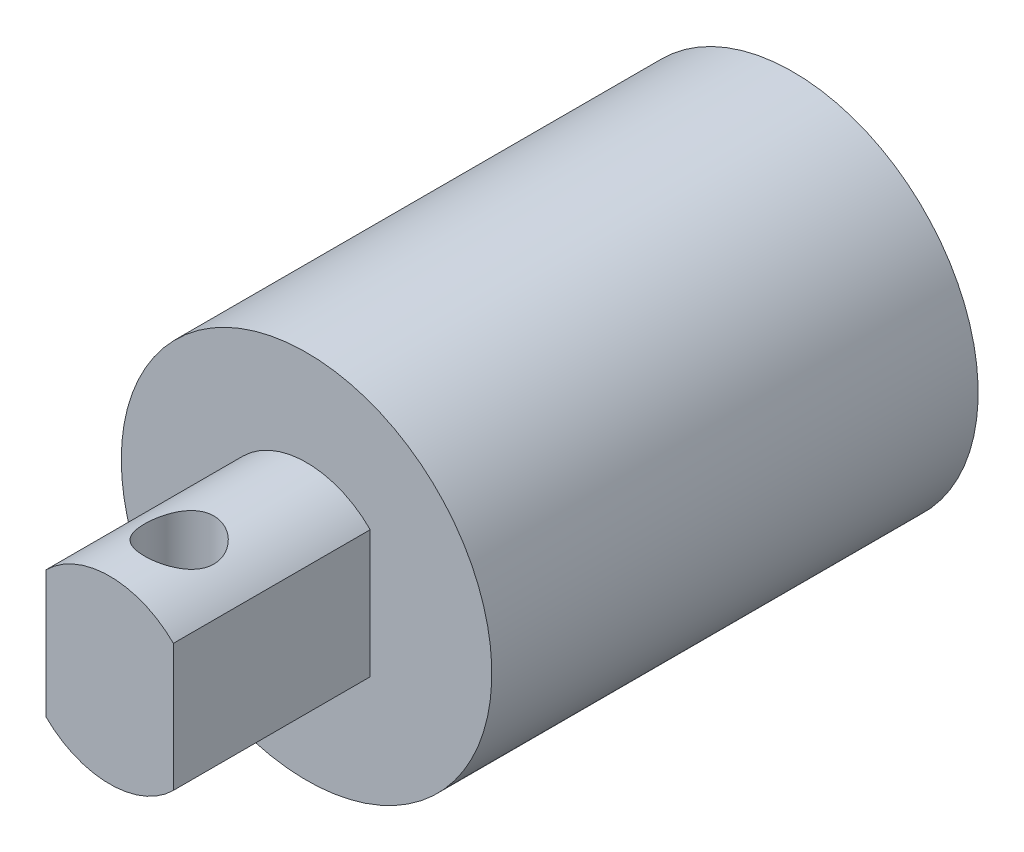
ISO-10303-21;
HEADER;
FILE_DESCRIPTION(('STEP AP214'),'2;1');
FILE_NAME('part.step','',(''),(''),'','','');
FILE_SCHEMA(('AUTOMOTIVE_DESIGN { 1 0 10303 214 1 1 1 1 }'));
ENDSEC;
DATA;
#1=APPLICATION_CONTEXT('core data for automotive mechanical design processes');
#2=APPLICATION_PROTOCOL_DEFINITION('international standard','automotive_design',2000,#1);
#3=PRODUCT_CONTEXT('',#1,'mechanical');
#4=PRODUCT('Part','Part','',(#3));
#5=PRODUCT_RELATED_PRODUCT_CATEGORY('part','',(#4));
#6=PRODUCT_DEFINITION_FORMATION('','',#4);
#7=PRODUCT_DEFINITION_CONTEXT('part definition',#1,'design');
#8=PRODUCT_DEFINITION('design','',#6,#7);
#9=PRODUCT_DEFINITION_SHAPE('','',#8);
#10=(LENGTH_UNIT() NAMED_UNIT(*) SI_UNIT(.MILLI.,.METRE.));
#11=(NAMED_UNIT(*) PLANE_ANGLE_UNIT() SI_UNIT($,.RADIAN.));
#12=(NAMED_UNIT(*) SI_UNIT($,.STERADIAN.) SOLID_ANGLE_UNIT());
#13=UNCERTAINTY_MEASURE_WITH_UNIT(LENGTH_MEASURE(1.E-05),#10,'distance_accuracy_value','');
#14=(GEOMETRIC_REPRESENTATION_CONTEXT(3) GLOBAL_UNCERTAINTY_ASSIGNED_CONTEXT((#13)) GLOBAL_UNIT_ASSIGNED_CONTEXT((#10,
#11,#12)) REPRESENTATION_CONTEXT('',''));
#15=CARTESIAN_POINT('',(0.,0.,0.));
#16=DIRECTION('',(0.,0.,1.));
#17=DIRECTION('',(1.,0.,0.));
#18=AXIS2_PLACEMENT_3D('',#15,#16,#17);
#19=CARTESIAN_POINT('',(0.,0.,21.));
#20=DIRECTION('',(0.,0.,1.));
#21=DIRECTION('',(1.,0.,0.));
#22=AXIS2_PLACEMENT_3D('',#19,#20,#21);
#23=PLANE('',#22);
#24=CARTESIAN_POINT('',(0.,0.,21.));
#25=DIRECTION('',(0.,0.,1.));
#26=DIRECTION('',(1.,0.,0.));
#27=AXIS2_PLACEMENT_3D('',#24,#25,#26);
#28=CIRCLE('',#27,8.);
#29=CARTESIAN_POINT('',(-8.,0.,21.));
#30=VERTEX_POINT('',#29);
#31=EDGE_CURVE('E206',#30,#30,#28,.T.);
#32=ORIENTED_EDGE('',*,*,#31,.T.);
#33=EDGE_LOOP('',(#32));
#34=FACE_BOUND('',#33,.T.);
#35=DIRECTION('',(0.,1.,0.));
#36=VECTOR('',#35,1.);
#37=CARTESIAN_POINT('',(2.75,2.75,21.));
#38=LINE('',#37,#36);
#39=CARTESIAN_POINT('',(2.75,-2.75,21.));
#40=VERTEX_POINT('',#39);
#41=CARTESIAN_POINT('',(2.75,2.75,21.));
#42=VERTEX_POINT('',#41);
#43=EDGE_CURVE('E323',#40,#42,#38,.T.);
#44=ORIENTED_EDGE('',*,*,#43,.F.);
#45=CARTESIAN_POINT('',(0.,0.,21.));
#46=DIRECTION('',(0.,0.,1.));
#47=DIRECTION('',(1.,0.,0.));
#48=AXIS2_PLACEMENT_3D('',#45,#46,#47);
#49=CIRCLE('',#48,3.88908729652601);
#50=CARTESIAN_POINT('',(-2.75,-2.75,21.));
#51=VERTEX_POINT('',#50);
#52=EDGE_CURVE('E150',#51,#40,#49,.T.);
#53=ORIENTED_EDGE('',*,*,#52,.F.);
#54=DIRECTION('',(0.,-1.,0.));
#55=VECTOR('',#54,1.);
#56=CARTESIAN_POINT('',(-2.75,2.75,21.));
#57=LINE('',#56,#55);
#58=CARTESIAN_POINT('',(-2.75,2.75,21.));
#59=VERTEX_POINT('',#58);
#60=EDGE_CURVE('E146',#59,#51,#57,.T.);
#61=ORIENTED_EDGE('',*,*,#60,.F.);
#62=CARTESIAN_POINT('',(0.,0.,21.));
#63=DIRECTION('',(0.,0.,1.));
#64=DIRECTION('',(1.,0.,0.));
#65=AXIS2_PLACEMENT_3D('',#62,#63,#64);
#66=CIRCLE('',#65,3.88908729652601);
#67=EDGE_CURVE('E321',#42,#59,#66,.T.);
#68=ORIENTED_EDGE('',*,*,#67,.F.);
#69=EDGE_LOOP('',(#44,#53,#61,#68));
#70=FACE_BOUND('',#69,.T.);
#71=ADVANCED_FACE('F32',(#34,#70),#23,.T.);
#72=CARTESIAN_POINT('',(0.,0.,21.));
#73=DIRECTION('',(0.,0.,-1.));
#74=DIRECTION('',(-1.,0.,0.));
#75=AXIS2_PLACEMENT_3D('',#72,#73,#74);
#76=CYLINDRICAL_SURFACE('',#75,8.);
#77=CARTESIAN_POINT('',(0.,0.,0.));
#78=DIRECTION('',(0.,0.,1.));
#79=DIRECTION('',(1.,0.,0.));
#80=AXIS2_PLACEMENT_3D('',#77,#78,#79);
#81=CIRCLE('',#80,8.);
#82=CARTESIAN_POINT('',(-8.,0.,0.));
#83=VERTEX_POINT('',#82);
#84=EDGE_CURVE('E198',#83,#83,#81,.T.);
#85=CARTESIAN_POINT('',(-8.,0.,21.));
#86=CARTESIAN_POINT('',(-8.,0.,20.78125));
#87=CARTESIAN_POINT('',(-8.,0.,20.5625));
#88=CARTESIAN_POINT('',(-8.,0.,20.125));
#89=CARTESIAN_POINT('',(-8.,0.,19.90625));
#90=CARTESIAN_POINT('',(-8.,0.,19.46875));
#91=CARTESIAN_POINT('',(-8.,0.,19.25));
#92=CARTESIAN_POINT('',(-8.,0.,18.8125));
#93=CARTESIAN_POINT('',(-8.,0.,18.59375));
#94=CARTESIAN_POINT('',(-8.,0.,18.15625));
#95=CARTESIAN_POINT('',(-8.,0.,17.9375));
#96=CARTESIAN_POINT('',(-8.,0.,17.5));
#97=CARTESIAN_POINT('',(-8.,0.,17.28125));
#98=CARTESIAN_POINT('',(-8.,0.,16.84375));
#99=CARTESIAN_POINT('',(-8.,0.,16.625));
#100=CARTESIAN_POINT('',(-8.,0.,16.1875));
#101=CARTESIAN_POINT('',(-8.,0.,15.96875));
#102=CARTESIAN_POINT('',(-8.,0.,15.53125));
#103=CARTESIAN_POINT('',(-8.,0.,15.3125));
#104=CARTESIAN_POINT('',(-8.,0.,14.875));
#105=CARTESIAN_POINT('',(-8.,0.,14.65625));
#106=CARTESIAN_POINT('',(-8.,0.,14.21875));
#107=CARTESIAN_POINT('',(-8.,0.,14.));
#108=CARTESIAN_POINT('',(-8.,0.,13.5625));
#109=CARTESIAN_POINT('',(-8.,0.,13.34375));
#110=CARTESIAN_POINT('',(-8.,0.,12.90625));
#111=CARTESIAN_POINT('',(-8.,0.,12.6875));
#112=CARTESIAN_POINT('',(-8.,0.,12.25));
#113=CARTESIAN_POINT('',(-8.,0.,12.03125));
#114=CARTESIAN_POINT('',(-8.,0.,11.59375));
#115=CARTESIAN_POINT('',(-8.,0.,11.375));
#116=CARTESIAN_POINT('',(-8.,0.,10.9375));
#117=CARTESIAN_POINT('',(-8.,0.,10.71875));
#118=CARTESIAN_POINT('',(-8.,0.,10.28125));
#119=CARTESIAN_POINT('',(-8.,0.,10.0625));
#120=CARTESIAN_POINT('',(-8.,0.,9.625));
#121=CARTESIAN_POINT('',(-8.,0.,9.40625));
#122=CARTESIAN_POINT('',(-8.,0.,8.96875));
#123=CARTESIAN_POINT('',(-8.,0.,8.75));
#124=CARTESIAN_POINT('',(-8.,0.,8.3125));
#125=CARTESIAN_POINT('',(-8.,0.,8.09375));
#126=CARTESIAN_POINT('',(-8.,0.,7.65625));
#127=CARTESIAN_POINT('',(-8.,0.,7.4375));
#128=CARTESIAN_POINT('',(-8.,0.,7.));
#129=CARTESIAN_POINT('',(-8.,0.,6.78125));
#130=CARTESIAN_POINT('',(-8.,0.,6.34375));
#131=CARTESIAN_POINT('',(-8.,0.,6.125));
#132=CARTESIAN_POINT('',(-8.,0.,5.6875));
#133=CARTESIAN_POINT('',(-8.,0.,5.46875));
#134=CARTESIAN_POINT('',(-8.,0.,5.03125));
#135=CARTESIAN_POINT('',(-8.,0.,4.8125));
#136=CARTESIAN_POINT('',(-8.,0.,4.375));
#137=CARTESIAN_POINT('',(-8.,0.,4.15625));
#138=CARTESIAN_POINT('',(-8.,0.,3.71875));
#139=CARTESIAN_POINT('',(-8.,0.,3.5));
#140=CARTESIAN_POINT('',(-8.,0.,3.0625));
#141=CARTESIAN_POINT('',(-8.,0.,2.84375));
#142=CARTESIAN_POINT('',(-8.,0.,2.40625));
#143=CARTESIAN_POINT('',(-8.,0.,2.1875));
#144=CARTESIAN_POINT('',(-8.,0.,1.75));
#145=CARTESIAN_POINT('',(-8.,0.,1.53125));
#146=CARTESIAN_POINT('',(-8.,0.,1.09375));
#147=CARTESIAN_POINT('',(-8.,0.,0.875000000000001));
#148=CARTESIAN_POINT('',(-8.,0.,0.4375));
#149=CARTESIAN_POINT('',(-8.,0.,0.21875));
#150=CARTESIAN_POINT('',(-8.,0.,0.));
#151=B_SPLINE_CURVE_WITH_KNOTS('',3,(#85,#86,#87,#88,#89,#90,#91,#92,#93,#94,#95,#96,#97,#98,
#99,#100,#101,#102,#103,#104,#105,#106,#107,#108,#109,#110,#111,#112,#113,#114,#115,#116,#117,
#118,#119,#120,#121,#122,#123,#124,#125,#126,#127,#128,#129,#130,#131,#132,#133,#134,#135,#136,
#137,#138,#139,#140,#141,#142,#143,#144,#145,#146,#147,#148,#149,#150),.UNSPECIFIED.,.F.,.F.,(4,
2,2,2,2,2,2,2,2,2,2,2,2,2,2,2,2,2,2,2,2,2,2,2,2,2,2,2,2,2,2,2,4),(0.,0.656249999999997,1.3125,
1.96875,2.625,3.28125,3.9375,4.59375,5.25,5.90625,6.5625,7.21875,7.875,8.53125,9.1875,9.84375,
10.5,11.15625,11.8125,12.46875,13.125,13.78125,14.4375,15.09375,15.75,16.40625,17.0625,17.71875,
18.375,19.03125,19.6875,20.34375,21.),.UNSPECIFIED.);
#152=EDGE_CURVE('BSEAM34',#30,#83,#151,.T.);
#153=ORIENTED_EDGE('',*,*,#31,.F.);
#154=ORIENTED_EDGE('',*,*,#84,.T.);
#155=ORIENTED_EDGE('',*,*,#152,.T.);
#156=ORIENTED_EDGE('',*,*,#152,.F.);
#157=EDGE_LOOP('',(#153,#155,#154,#156));
#158=FACE_BOUND('',#157,.T.);
#159=ADVANCED_FACE('F34',(#158),#76,.T.);
#160=CARTESIAN_POINT('',(0.,0.,0.));
#161=DIRECTION('',(0.,0.,1.));
#162=DIRECTION('',(1.,0.,0.));
#163=AXIS2_PLACEMENT_3D('',#160,#161,#162);
#164=PLANE('',#163);
#165=DIRECTION('',(0.,1.,0.));
#166=VECTOR('',#165,1.);
#167=CARTESIAN_POINT('',(-1.25,3.,0.));
#168=LINE('',#167,#166);
#169=CARTESIAN_POINT('',(-1.25,1.5612494995996,0.));
#170=VERTEX_POINT('',#169);
#171=CARTESIAN_POINT('',(-1.25,3.,0.));
#172=VERTEX_POINT('',#171);
#173=EDGE_CURVE('E190',#170,#172,#168,.T.);
#174=ORIENTED_EDGE('',*,*,#173,.F.);
#175=CARTESIAN_POINT('',(0.,0.,0.));
#176=DIRECTION('',(0.,0.,-1.));
#177=DIRECTION('',(-1.,0.,0.));
#178=AXIS2_PLACEMENT_3D('',#175,#176,#177);
#179=CIRCLE('',#178,2.);
#180=CARTESIAN_POINT('',(-1.25,-1.5612494995996,0.));
#181=VERTEX_POINT('',#180);
#182=EDGE_CURVE('E152',#181,#170,#179,.T.);
#183=ORIENTED_EDGE('',*,*,#182,.F.);
#184=CARTESIAN_POINT('',(-1.25,-6.,0.));
#185=VERTEX_POINT('',#184);
#186=EDGE_CURVE('E191',#185,#181,#168,.T.);
#187=ORIENTED_EDGE('',*,*,#186,.F.);
#188=DIRECTION('',(-1.,0.,0.));
#189=VECTOR('',#188,1.);
#190=CARTESIAN_POINT('',(1.25,-6.,0.));
#191=LINE('',#190,#189);
#192=CARTESIAN_POINT('',(1.25,-6.,0.));
#193=VERTEX_POINT('',#192);
#194=EDGE_CURVE('E187',#193,#185,#191,.T.);
#195=ORIENTED_EDGE('',*,*,#194,.F.);
#196=DIRECTION('',(0.,-1.,0.));
#197=VECTOR('',#196,1.);
#198=CARTESIAN_POINT('',(1.25,3.,0.));
#199=LINE('',#198,#197);
#200=CARTESIAN_POINT('',(1.25,-1.5612494995996,0.));
#201=VERTEX_POINT('',#200);
#202=EDGE_CURVE('E169',#201,#193,#199,.T.);
#203=ORIENTED_EDGE('',*,*,#202,.F.);
#204=CARTESIAN_POINT('',(1.25,1.5612494995996,0.));
#205=VERTEX_POINT('',#204);
#206=EDGE_CURVE('E154',#205,#201,#179,.T.);
#207=ORIENTED_EDGE('',*,*,#206,.F.);
#208=CARTESIAN_POINT('',(1.25,3.,0.));
#209=VERTEX_POINT('',#208);
#210=EDGE_CURVE('E184',#209,#205,#199,.T.);
#211=ORIENTED_EDGE('',*,*,#210,.F.);
#212=DIRECTION('',(1.,0.,0.));
#213=VECTOR('',#212,1.);
#214=CARTESIAN_POINT('',(1.25,3.,0.));
#215=LINE('',#214,#213);
#216=EDGE_CURVE('E174',#172,#209,#215,.T.);
#217=ORIENTED_EDGE('',*,*,#216,.F.);
#218=EDGE_LOOP('',(#174,#183,#187,#195,#203,#207,#211,#217));
#219=FACE_BOUND('',#218,.T.);
#220=ORIENTED_EDGE('',*,*,#84,.F.);
#221=EDGE_LOOP('',(#220));
#222=FACE_BOUND('',#221,.T.);
#223=ADVANCED_FACE('F225',(#219,#222),#164,.F.);
#224=CARTESIAN_POINT('',(1.25,3.,10.));
#225=DIRECTION('',(1.,0.,0.));
#226=DIRECTION('',(0.,1.,0.));
#227=AXIS2_PLACEMENT_3D('',#224,#225,#226);
#228=PLANE('',#227);
#229=DIRECTION('',(0.,1.,0.));
#230=VECTOR('',#229,1.);
#231=CARTESIAN_POINT('',(1.25,3.,2.));
#232=LINE('',#231,#230);
#233=CARTESIAN_POINT('',(1.25,-1.5612494995996,2.));
#234=VERTEX_POINT('',#233);
#235=CARTESIAN_POINT('',(1.25,1.5612494995996,2.));
#236=VERTEX_POINT('',#235);
#237=EDGE_CURVE('E161',#234,#236,#232,.T.);
#238=ORIENTED_EDGE('',*,*,#237,.F.);
#239=DIRECTION('',(0.,0.,-1.));
#240=VECTOR('',#239,1.);
#241=CARTESIAN_POINT('',(1.25,-1.5612494995996,2.));
#242=LINE('',#241,#240);
#243=EDGE_CURVE('E166',#234,#201,#242,.T.);
#244=ORIENTED_EDGE('',*,*,#243,.T.);
#245=ORIENTED_EDGE('',*,*,#202,.T.);
#246=DIRECTION('',(0.,0.,-1.));
#247=VECTOR('',#246,1.);
#248=CARTESIAN_POINT('',(1.25,-6.,10.));
#249=LINE('',#248,#247);
#250=CARTESIAN_POINT('',(1.25,-6.,10.));
#251=VERTEX_POINT('',#250);
#252=EDGE_CURVE('E183',#251,#193,#249,.T.);
#253=ORIENTED_EDGE('',*,*,#252,.F.);
#254=DIRECTION('',(0.,-1.,0.));
#255=VECTOR('',#254,1.);
#256=CARTESIAN_POINT('',(1.25,3.,10.));
#257=LINE('',#256,#255);
#258=CARTESIAN_POINT('',(1.25,3.,10.));
#259=VERTEX_POINT('',#258);
#260=EDGE_CURVE('E170',#259,#251,#257,.T.);
#261=ORIENTED_EDGE('',*,*,#260,.F.);
#262=DIRECTION('',(0.,0.,-1.));
#263=VECTOR('',#262,1.);
#264=CARTESIAN_POINT('',(1.25,3.,10.));
#265=LINE('',#264,#263);
#266=EDGE_CURVE('E196',#259,#209,#265,.T.);
#267=ORIENTED_EDGE('',*,*,#266,.T.);
#268=ORIENTED_EDGE('',*,*,#210,.T.);
#269=DIRECTION('',(0.,0.,-1.));
#270=VECTOR('',#269,1.);
#271=CARTESIAN_POINT('',(1.25,1.5612494995996,2.));
#272=LINE('',#271,#270);
#273=EDGE_CURVE('E163',#205,#236,#272,.F.);
#274=ORIENTED_EDGE('',*,*,#273,.T.);
#275=EDGE_LOOP('',(#238,#244,#245,#253,#261,#267,#268,#274));
#276=FACE_BOUND('',#275,.T.);
#277=ADVANCED_FACE('F244',(#276),#228,.F.);
#278=CARTESIAN_POINT('',(1.25,3.,10.));
#279=DIRECTION('',(0.,1.,0.));
#280=DIRECTION('',(0.,0.,1.));
#281=AXIS2_PLACEMENT_3D('',#278,#279,#280);
#282=PLANE('',#281);
#283=ORIENTED_EDGE('',*,*,#216,.T.);
#284=ORIENTED_EDGE('',*,*,#266,.F.);
#285=DIRECTION('',(1.,0.,0.));
#286=VECTOR('',#285,1.);
#287=CARTESIAN_POINT('',(1.25,3.,10.));
#288=LINE('',#287,#286);
#289=CARTESIAN_POINT('',(-1.25,3.,10.));
#290=VERTEX_POINT('',#289);
#291=EDGE_CURVE('E180',#290,#259,#288,.T.);
#292=ORIENTED_EDGE('',*,*,#291,.F.);
#293=DIRECTION('',(0.,0.,-1.));
#294=VECTOR('',#293,1.);
#295=CARTESIAN_POINT('',(-1.25,3.,10.));
#296=LINE('',#295,#294);
#297=EDGE_CURVE('E199',#290,#172,#296,.T.);
#298=ORIENTED_EDGE('',*,*,#297,.T.);
#299=EDGE_LOOP('',(#283,#284,#292,#298));
#300=FACE_BOUND('',#299,.T.);
#301=ADVANCED_FACE('F233',(#300),#282,.F.);
#302=CARTESIAN_POINT('',(-1.25,3.,10.));
#303=DIRECTION('',(-1.,0.,0.));
#304=DIRECTION('',(0.,-1.,0.));
#305=AXIS2_PLACEMENT_3D('',#302,#303,#304);
#306=PLANE('',#305);
#307=DIRECTION('',(0.,-1.,0.));
#308=VECTOR('',#307,1.);
#309=CARTESIAN_POINT('',(-1.25,3.,2.));
#310=LINE('',#309,#308);
#311=CARTESIAN_POINT('',(-1.25,1.5612494995996,2.));
#312=VERTEX_POINT('',#311);
#313=CARTESIAN_POINT('',(-1.25,-1.5612494995996,2.));
#314=VERTEX_POINT('',#313);
#315=EDGE_CURVE('E209',#312,#314,#310,.T.);
#316=ORIENTED_EDGE('',*,*,#315,.F.);
#317=DIRECTION('',(0.,0.,-1.));
#318=VECTOR('',#317,1.);
#319=CARTESIAN_POINT('',(-1.25,1.5612494995996,2.));
#320=LINE('',#319,#318);
#321=EDGE_CURVE('E11',#312,#170,#320,.T.);
#322=ORIENTED_EDGE('',*,*,#321,.T.);
#323=ORIENTED_EDGE('',*,*,#173,.T.);
#324=ORIENTED_EDGE('',*,*,#297,.F.);
#325=DIRECTION('',(0.,1.,0.));
#326=VECTOR('',#325,1.);
#327=CARTESIAN_POINT('',(-1.25,3.,10.));
#328=LINE('',#327,#326);
#329=CARTESIAN_POINT('',(-1.25,-6.,10.));
#330=VERTEX_POINT('',#329);
#331=EDGE_CURVE('E177',#330,#290,#328,.T.);
#332=ORIENTED_EDGE('',*,*,#331,.F.);
#333=DIRECTION('',(0.,0.,-1.));
#334=VECTOR('',#333,1.);
#335=CARTESIAN_POINT('',(-1.25,-6.,10.));
#336=LINE('',#335,#334);
#337=EDGE_CURVE('E202',#330,#185,#336,.T.);
#338=ORIENTED_EDGE('',*,*,#337,.T.);
#339=ORIENTED_EDGE('',*,*,#186,.T.);
#340=DIRECTION('',(0.,0.,-1.));
#341=VECTOR('',#340,1.);
#342=CARTESIAN_POINT('',(-1.25,-1.5612494995996,2.));
#343=LINE('',#342,#341);
#344=EDGE_CURVE('E46',#181,#314,#343,.F.);
#345=ORIENTED_EDGE('',*,*,#344,.T.);
#346=EDGE_LOOP('',(#316,#322,#323,#324,#332,#338,#339,#345));
#347=FACE_BOUND('',#346,.T.);
#348=ADVANCED_FACE('F216',(#347),#306,.F.);
#349=CARTESIAN_POINT('',(1.25,-6.,10.));
#350=DIRECTION('',(0.,-1.,0.));
#351=DIRECTION('',(0.,0.,-1.));
#352=AXIS2_PLACEMENT_3D('',#349,#350,#351);
#353=PLANE('',#352);
#354=ORIENTED_EDGE('',*,*,#194,.T.);
#355=ORIENTED_EDGE('',*,*,#337,.F.);
#356=DIRECTION('',(-1.,0.,0.));
#357=VECTOR('',#356,1.);
#358=CARTESIAN_POINT('',(1.25,-6.,10.));
#359=LINE('',#358,#357);
#360=EDGE_CURVE('E173',#251,#330,#359,.T.);
#361=ORIENTED_EDGE('',*,*,#360,.F.);
#362=ORIENTED_EDGE('',*,*,#252,.T.);
#363=EDGE_LOOP('',(#354,#355,#361,#362));
#364=FACE_BOUND('',#363,.T.);
#365=ADVANCED_FACE('F239',(#364),#353,.F.);
#366=CARTESIAN_POINT('',(0.,0.,10.));
#367=DIRECTION('',(0.,0.,-1.));
#368=DIRECTION('',(-1.,0.,0.));
#369=AXIS2_PLACEMENT_3D('',#366,#367,#368);
#370=PLANE('',#369);
#371=ORIENTED_EDGE('',*,*,#260,.T.);
#372=ORIENTED_EDGE('',*,*,#360,.T.);
#373=ORIENTED_EDGE('',*,*,#331,.T.);
#374=ORIENTED_EDGE('',*,*,#291,.T.);
#375=EDGE_LOOP('',(#371,#372,#373,#374));
#376=FACE_BOUND('',#375,.T.);
#377=ADVANCED_FACE('F236',(#376),#370,.T.);
#378=CARTESIAN_POINT('',(0.,0.,2.));
#379=DIRECTION('',(0.,0.,-1.));
#380=DIRECTION('',(-1.,0.,0.));
#381=AXIS2_PLACEMENT_3D('',#378,#379,#380);
#382=PLANE('',#381);
#383=ORIENTED_EDGE('',*,*,#315,.T.);
#384=CARTESIAN_POINT('',(0.,0.,2.));
#385=DIRECTION('',(0.,0.,-1.));
#386=DIRECTION('',(-1.,0.,0.));
#387=AXIS2_PLACEMENT_3D('',#384,#385,#386);
#388=CIRCLE('',#387,2.);
#389=EDGE_CURVE('E159',#314,#312,#388,.T.);
#390=ORIENTED_EDGE('',*,*,#389,.T.);
#391=EDGE_LOOP('',(#383,#390));
#392=FACE_BOUND('',#391,.T.);
#393=ADVANCED_FACE('F255',(#392),#382,.T.);
#394=CARTESIAN_POINT('',(0.,0.,2.));
#395=DIRECTION('',(0.,0.,-1.));
#396=DIRECTION('',(-1.,0.,0.));
#397=AXIS2_PLACEMENT_3D('',#394,#395,#396);
#398=CYLINDRICAL_SURFACE('',#397,2.);
#399=ORIENTED_EDGE('',*,*,#389,.F.);
#400=ORIENTED_EDGE('',*,*,#344,.F.);
#401=ORIENTED_EDGE('',*,*,#182,.T.);
#402=ORIENTED_EDGE('',*,*,#321,.F.);
#403=EDGE_LOOP('',(#399,#400,#401,#402));
#404=FACE_BOUND('',#403,.T.);
#405=ADVANCED_FACE('F221',(#404),#398,.F.);
#406=EDGE_CURVE('E60',#236,#234,#388,.T.);
#407=ORIENTED_EDGE('',*,*,#406,.F.);
#408=ORIENTED_EDGE('',*,*,#273,.F.);
#409=ORIENTED_EDGE('',*,*,#206,.T.);
#410=ORIENTED_EDGE('',*,*,#243,.F.);
#411=EDGE_LOOP('',(#407,#408,#409,#410));
#412=FACE_BOUND('',#411,.T.);
#413=ADVANCED_FACE('F246',(#412),#398,.F.);
#414=ORIENTED_EDGE('',*,*,#237,.T.);
#415=ORIENTED_EDGE('',*,*,#406,.T.);
#416=EDGE_LOOP('',(#414,#415));
#417=FACE_BOUND('',#416,.T.);
#418=ADVANCED_FACE('F248',(#417),#382,.T.);
#419=CARTESIAN_POINT('',(0.,0.,29.5));
#420=DIRECTION('',(0.,0.,-1.));
#421=DIRECTION('',(-1.,0.,0.));
#422=AXIS2_PLACEMENT_3D('',#419,#420,#421);
#423=CYLINDRICAL_SURFACE('',#422,3.88908729652601);
#424=CARTESIAN_POINT('',(0.,-3.88908729652601,28.));
#425=CARTESIAN_POINT('',(0.081068896454346,-3.88909014632073,28.0000037310671));
#426=CARTESIAN_POINT('',(0.162113025773897,-3.88653077967345,27.9934075800009));
#427=CARTESIAN_POINT('',(0.321770289241838,-3.8765779365136,27.9673114101852));
#428=CARTESIAN_POINT('',(0.400383921661905,-3.86918545780345,27.9478140548963));
#429=CARTESIAN_POINT('',(0.55285378028242,-3.85035713694501,27.8967136547202));
#430=CARTESIAN_POINT('',(0.626719164848396,-3.83892937260544,27.865134784069));
#431=CARTESIAN_POINT('',(0.768095824184376,-3.81316126663576,27.790894422986));
#432=CARTESIAN_POINT('',(0.835605288638505,-3.79882009885036,27.7482297879986));
#433=CARTESIAN_POINT('',(0.965361008858226,-3.76798421614903,27.6510473124448));
#434=CARTESIAN_POINT('',(1.02728714920587,-3.75142615733817,27.5961223650476));
#435=CARTESIAN_POINT('',(1.1413105944439,-3.71832509898968,27.476842619767));
#436=CARTESIAN_POINT('',(1.19340463267815,-3.701782106268,27.4124847004089));
#437=CARTESIAN_POINT('',(1.28838003640119,-3.66983571591638,27.2729695247264));
#438=CARTESIAN_POINT('',(1.33079913019062,-3.65450629214146,27.1974789214334));
#439=CARTESIAN_POINT('',(1.40219557715015,-3.6277145179878,27.0397518316469));
#440=CARTESIAN_POINT('',(1.43117865342826,-3.61625052168818,26.9575182349487));
#441=CARTESIAN_POINT('',(1.47359989627533,-3.59916783629752,26.7923322043448));
#442=CARTESIAN_POINT('',(1.48765146518362,-3.59331953170052,26.7095618725911));
#443=CARTESIAN_POINT('',(1.50172815888172,-3.58746102878838,26.542647305092));
#444=CARTESIAN_POINT('',(1.50175951547397,-3.5874482366636,26.4585036963826));
#445=CARTESIAN_POINT('',(1.48826209531603,-3.59306513012942,26.2969589766522));
#446=CARTESIAN_POINT('',(1.47559962365855,-3.5983343383407,26.2194705784817));
#447=CARTESIAN_POINT('',(1.43851132827545,-3.61331993616802,26.0678181471729));
#448=CARTESIAN_POINT('',(1.41408362659173,-3.6230370357412,25.993654646819));
#449=CARTESIAN_POINT('',(1.3537061703761,-3.64603028949291,25.8490458873095));
#450=CARTESIAN_POINT('',(1.31754017621377,-3.65937240550836,25.7787018656324));
#451=CARTESIAN_POINT('',(1.23486388489639,-3.68809202150451,25.6448357935003));
#452=CARTESIAN_POINT('',(1.18834987500031,-3.70347025121406,25.5813162037282));
#453=CARTESIAN_POINT('',(1.08238906224931,-3.73586832267494,25.4581288272979));
#454=CARTESIAN_POINT('',(1.02225584411999,-3.75292696554109,25.3990601682438));
#455=CARTESIAN_POINT('',(0.892746622536095,-3.78582396224733,25.29166168633));
#456=CARTESIAN_POINT('',(0.823369032809874,-3.8016621059202,25.2433337103044));
#457=CARTESIAN_POINT('',(0.675740471630755,-3.83068170527909,25.1580757760181));
#458=CARTESIAN_POINT('',(0.59735738168454,-3.84381277001342,25.1213562032822));
#459=CARTESIAN_POINT('',(0.43489287479109,-3.86556200515082,25.0618265474017));
#460=CARTESIAN_POINT('',(0.350814162106993,-3.87418230052396,25.0390099139122));
#461=CARTESIAN_POINT('',(0.184378975005043,-3.88555937262668,25.0091107515114));
#462=CARTESIAN_POINT('',(0.102187710408948,-3.88861618576873,25.0012221295086));
#463=CARTESIAN_POINT('',(-0.0623921429322346,-3.88945660351863,24.9990418296676));
#464=CARTESIAN_POINT('',(-0.144780680248087,-3.88724145874951,25.0047469271038));
#465=CARTESIAN_POINT('',(-0.303861552045744,-3.87798426426593,25.0289875512781));
#466=CARTESIAN_POINT('',(-0.380648796835748,-3.87114449120524,25.046985714612));
#467=CARTESIAN_POINT('',(-0.530052549664855,-3.85353175180192,25.094584111641));
#468=CARTESIAN_POINT('',(-0.602668515662463,-3.8427582756219,25.1241858492829));
#469=CARTESIAN_POINT('',(-0.74411089328584,-3.81793294353712,25.1951070098562));
#470=CARTESIAN_POINT('',(-0.812758547800401,-3.8037925241296,25.236750975195));
#471=CARTESIAN_POINT('',(-0.94232674335347,-3.77378463657631,25.3302106723397));
#472=CARTESIAN_POINT('',(-1.00324430607667,-3.75791650711246,25.3820303052421));
#473=CARTESIAN_POINT('',(-1.11954107300166,-3.72498369895454,25.4981097968852));
#474=CARTESIAN_POINT('',(-1.17435043143532,-3.70790538208034,25.5629381899839));
#475=CARTESIAN_POINT('',(-1.27243650512744,-3.67540239219981,25.7011949697762));
#476=CARTESIAN_POINT('',(-1.31571184539601,-3.65997791648157,25.7746243803111));
#477=CARTESIAN_POINT('',(-1.38963552589029,-3.63255907471995,25.9288048211129));
#478=CARTESIAN_POINT('',(-1.42020213382456,-3.62058705840589,26.0095992886583));
#479=CARTESIAN_POINT('',(-1.4670802539462,-3.60185023079079,26.1757839746875));
#480=CARTESIAN_POINT('',(-1.48340129053678,-3.59508194070753,26.2611710819821));
#481=CARTESIAN_POINT('',(-1.50044838200819,-3.5879983078993,26.4279028930707));
#482=CARTESIAN_POINT('',(-1.50215340331108,-3.58727795299216,26.509131040567));
#483=CARTESIAN_POINT('',(-1.49245465535927,-3.59132376147989,26.6706537623643));
#484=CARTESIAN_POINT('',(-1.48105228558336,-3.59608933914071,26.750948435408));
#485=CARTESIAN_POINT('',(-1.44624090924552,-3.61022425392835,26.9055283277189));
#486=CARTESIAN_POINT('',(-1.42325547765504,-3.61943071832022,26.9799251386449));
#487=CARTESIAN_POINT('',(-1.36631316123451,-3.64130662776437,27.12384422626));
#488=CARTESIAN_POINT('',(-1.33235343054475,-3.65397697093969,27.1933652328563));
#489=CARTESIAN_POINT('',(-1.25228069795348,-3.68221215522413,27.3296856773274));
#490=CARTESIAN_POINT('',(-1.20560585773001,-3.69789717575034,27.3961298634353));
#491=CARTESIAN_POINT('',(-1.10227675736491,-3.73000143915715,27.5205542101047));
#492=CARTESIAN_POINT('',(-1.045619234267,-3.74642092079161,27.5785315918258));
#493=CARTESIAN_POINT('',(-0.919971944768504,-3.77929924021054,27.6878472874602));
#494=CARTESIAN_POINT('',(-0.850454267957085,-3.79570406640713,27.7385979303217));
#495=CARTESIAN_POINT('',(-0.703297166945533,-3.82570370891098,27.8276944300091));
#496=CARTESIAN_POINT('',(-0.625656297789695,-3.83929802399948,27.8660380748933));
#497=CARTESIAN_POINT('',(-0.458849912944064,-3.86290130025502,27.9310817876559));
#498=CARTESIAN_POINT('',(-0.369259942159981,-3.87260475584321,27.9568163857542));
#499=CARTESIAN_POINT('',(-0.186434302253075,-3.88569428032577,27.9912684027962));
#500=CARTESIAN_POINT('',(-0.0932007838515338,-3.88908402026207,27.9999957105821));
#501=CARTESIAN_POINT('',(0.,-3.88908729652601,28.));
#502=B_SPLINE_CURVE_WITH_KNOTS('',3,(#424,#425,#426,#427,#428,#429,#430,#431,#432,#433,#434,
#435,#436,#437,#438,#439,#440,#441,#442,#443,#444,#445,#446,#447,#448,#449,#450,#451,#452,#453,
#454,#455,#456,#457,#458,#459,#460,#461,#462,#463,#464,#465,#466,#467,#468,#469,#470,#471,#472,
#473,#474,#475,#476,#477,#478,#479,#480,#481,#482,#483,#484,#485,#486,#487,#488,#489,#490,#491,
#492,#493,#494,#495,#496,#497,#498,#499,#500,#501),.UNSPECIFIED.,.T.,.F.,(4,2,2,2,2,2,2,2,2,2,2,
2,2,2,2,2,2,2,2,2,2,2,2,2,2,2,2,2,2,2,2,2,2,2,2,2,2,2,4),(0.,0.242862733788326,
0.485675344068349,0.728004623677815,0.970402716884468,1.22253243135226,1.47474576748806,
1.73724335324336,1.99962902447241,2.25076103372186,2.50178141794097,2.73676269938297,
2.97178150081552,3.21140203355309,3.45110867824776,3.70793572900485,3.9648069064357,
4.22609709948139,4.48726409074105,4.73387434299028,4.98042609975666,5.2168372445813,
5.4532790409429,5.69680584911981,5.94042620230562,6.19900734843463,6.45761930668721,
6.71786964060094,6.97794584095855,7.22045392625694,7.46293612132298,7.69713279627513,
7.93139025200505,8.17842455074515,8.42553974582915,8.68712723841206,8.94876134161749,
9.22813075205656,9.50733767539426),.UNSPECIFIED.);
#503=CARTESIAN_POINT('',(0.,-3.88908729652601,28.));
#504=VERTEX_POINT('',#503);
#505=EDGE_CURVE('E295',#504,#504,#502,.T.);
#506=ORIENTED_EDGE('',*,*,#505,.T.);
#507=EDGE_LOOP('',(#506));
#508=FACE_BOUND('',#507,.T.);
#509=ORIENTED_EDGE('',*,*,#52,.T.);
#510=DIRECTION('',(0.,0.,-1.));
#511=VECTOR('',#510,1.);
#512=CARTESIAN_POINT('',(2.75,-2.75,29.5));
#513=LINE('',#512,#511);
#514=CARTESIAN_POINT('',(2.75,-2.75,29.5));
#515=VERTEX_POINT('',#514);
#516=EDGE_CURVE('E131',#515,#40,#513,.T.);
#517=ORIENTED_EDGE('',*,*,#516,.F.);
#518=CARTESIAN_POINT('',(0.,0.,29.5));
#519=DIRECTION('',(0.,0.,1.));
#520=DIRECTION('',(1.,0.,0.));
#521=AXIS2_PLACEMENT_3D('',#518,#519,#520);
#522=CIRCLE('',#521,3.88908729652601);
#523=CARTESIAN_POINT('',(-2.75,-2.75,29.5));
#524=VERTEX_POINT('',#523);
#525=EDGE_CURVE('E138',#524,#515,#522,.T.);
#526=ORIENTED_EDGE('',*,*,#525,.F.);
#527=DIRECTION('',(0.,0.,-1.));
#528=VECTOR('',#527,1.);
#529=CARTESIAN_POINT('',(-2.75,-2.75,29.5));
#530=LINE('',#529,#528);
#531=EDGE_CURVE('E328',#524,#51,#530,.T.);
#532=ORIENTED_EDGE('',*,*,#531,.T.);
#533=EDGE_LOOP('',(#509,#517,#526,#532));
#534=FACE_BOUND('',#533,.T.);
#535=ADVANCED_FACE('F148',(#508,#534),#423,.T.);
#536=CARTESIAN_POINT('',(2.75,2.75,29.5));
#537=DIRECTION('',(-1.,0.,0.));
#538=DIRECTION('',(0.,-1.,0.));
#539=AXIS2_PLACEMENT_3D('',#536,#537,#538);
#540=PLANE('',#539);
#541=ORIENTED_EDGE('',*,*,#43,.T.);
#542=DIRECTION('',(0.,0.,-1.));
#543=VECTOR('',#542,1.);
#544=CARTESIAN_POINT('',(2.75,2.75,29.5));
#545=LINE('',#544,#543);
#546=CARTESIAN_POINT('',(2.75,2.75,29.5));
#547=VERTEX_POINT('',#546);
#548=EDGE_CURVE('E134',#547,#42,#545,.T.);
#549=ORIENTED_EDGE('',*,*,#548,.F.);
#550=DIRECTION('',(0.,1.,0.));
#551=VECTOR('',#550,1.);
#552=CARTESIAN_POINT('',(2.75,2.75,29.5));
#553=LINE('',#552,#551);
#554=EDGE_CURVE('E127',#515,#547,#553,.T.);
#555=ORIENTED_EDGE('',*,*,#554,.F.);
#556=ORIENTED_EDGE('',*,*,#516,.T.);
#557=EDGE_LOOP('',(#541,#549,#555,#556));
#558=FACE_BOUND('',#557,.T.);
#559=ADVANCED_FACE('F129',(#558),#540,.F.);
#560=CARTESIAN_POINT('',(0.,0.,29.5));
#561=DIRECTION('',(0.,0.,-1.));
#562=DIRECTION('',(-1.,0.,0.));
#563=AXIS2_PLACEMENT_3D('',#560,#561,#562);
#564=CYLINDRICAL_SURFACE('',#563,3.88908729652601);
#565=CARTESIAN_POINT('',(0.,3.88908729652601,28.));
#566=CARTESIAN_POINT('',(-0.0810688964543395,3.88909014632074,28.0000037310671));
#567=CARTESIAN_POINT('',(-0.16211302577389,3.88653077967345,27.9934075800009));
#568=CARTESIAN_POINT('',(-0.321770289241832,3.87657793651361,27.9673114101852));
#569=CARTESIAN_POINT('',(-0.400383921661899,3.86918545780345,27.9478140548963));
#570=CARTESIAN_POINT('',(-0.552853780282413,3.85035713694501,27.8967136547202));
#571=CARTESIAN_POINT('',(-0.62671916484839,3.83892937260545,27.865134784069));
#572=CARTESIAN_POINT('',(-0.768095824184369,3.81316126663577,27.790894422986));
#573=CARTESIAN_POINT('',(-0.835605288638498,3.79882009885037,27.7482297879986));
#574=CARTESIAN_POINT('',(-0.96536100885822,3.76798421614903,27.6510473124448));
#575=CARTESIAN_POINT('',(-1.02728714920586,3.75142615733817,27.5961223650476));
#576=CARTESIAN_POINT('',(-1.14131059444389,3.71832509898968,27.476842619767));
#577=CARTESIAN_POINT('',(-1.19340463267815,3.70178210626801,27.4124847004089));
#578=CARTESIAN_POINT('',(-1.28838003640118,3.66983571591638,27.2729695247264));
#579=CARTESIAN_POINT('',(-1.33079913019061,3.65450629214147,27.1974789214334));
#580=CARTESIAN_POINT('',(-1.40219557715014,3.62771451798781,27.0397518316469));
#581=CARTESIAN_POINT('',(-1.43117865342826,3.61625052168819,26.9575182349487));
#582=CARTESIAN_POINT('',(-1.47359989627532,3.59916783629752,26.7923322043448));
#583=CARTESIAN_POINT('',(-1.48765146518362,3.59331953170053,26.7095618725911));
#584=CARTESIAN_POINT('',(-1.50172815888171,3.58746102878838,26.542647305092));
#585=CARTESIAN_POINT('',(-1.50175951547396,3.5874482366636,26.4585036963826));
#586=CARTESIAN_POINT('',(-1.48826209531602,3.59306513012943,26.2969589766522));
#587=CARTESIAN_POINT('',(-1.47559962365855,3.59833433834071,26.2194705784817));
#588=CARTESIAN_POINT('',(-1.43851132827544,3.61331993616803,26.0678181471729));
#589=CARTESIAN_POINT('',(-1.41408362659172,3.6230370357412,25.993654646819));
#590=CARTESIAN_POINT('',(-1.3537061703761,3.64603028949292,25.8490458873095));
#591=CARTESIAN_POINT('',(-1.31754017621376,3.65937240550837,25.7787018656324));
#592=CARTESIAN_POINT('',(-1.23486388489639,3.68809202150452,25.6448357935003));
#593=CARTESIAN_POINT('',(-1.1883498750003,3.70347025121407,25.5813162037282));
#594=CARTESIAN_POINT('',(-1.0823890622493,3.73586832267495,25.4581288272979));
#595=CARTESIAN_POINT('',(-1.02225584411999,3.75292696554109,25.3990601682438));
#596=CARTESIAN_POINT('',(-0.892746622536088,3.78582396224733,25.29166168633));
#597=CARTESIAN_POINT('',(-0.823369032809867,3.80166210592021,25.2433337103044));
#598=CARTESIAN_POINT('',(-0.675740471630749,3.83068170527909,25.1580757760181));
#599=CARTESIAN_POINT('',(-0.597357381684533,3.84381277001343,25.1213562032822));
#600=CARTESIAN_POINT('',(-0.434892874791083,3.86556200515083,25.0618265474017));
#601=CARTESIAN_POINT('',(-0.350814162106987,3.87418230052397,25.0390099139122));
#602=CARTESIAN_POINT('',(-0.184378975005037,3.88555937262668,25.0091107515114));
#603=CARTESIAN_POINT('',(-0.102187710408941,3.88861618576874,25.0012221295086));
#604=CARTESIAN_POINT('',(0.0623921429322411,3.88945660351863,24.9990418296676));
#605=CARTESIAN_POINT('',(0.144780680248094,3.88724145874951,25.0047469271038));
#606=CARTESIAN_POINT('',(0.303861552045751,3.87798426426593,25.0289875512781));
#607=CARTESIAN_POINT('',(0.380648796835754,3.87114449120524,25.046985714612));
#608=CARTESIAN_POINT('',(0.530052549664861,3.85353175180192,25.094584111641));
#609=CARTESIAN_POINT('',(0.602668515662469,3.84275827562191,25.1241858492829));
#610=CARTESIAN_POINT('',(0.744110893285846,3.81793294353713,25.1951070098562));
#611=CARTESIAN_POINT('',(0.812758547800407,3.80379252412961,25.236750975195));
#612=CARTESIAN_POINT('',(0.942326743353476,3.77378463657631,25.3302106723397));
#613=CARTESIAN_POINT('',(1.00324430607668,3.75791650711246,25.3820303052421));
#614=CARTESIAN_POINT('',(1.11954107300166,3.72498369895454,25.4981097968852));
#615=CARTESIAN_POINT('',(1.17435043143533,3.70790538208034,25.5629381899839));
#616=CARTESIAN_POINT('',(1.27243650512745,3.67540239219981,25.7011949697762));
#617=CARTESIAN_POINT('',(1.31571184539602,3.65997791648157,25.7746243803111));
#618=CARTESIAN_POINT('',(1.3896355258903,3.63255907471995,25.9288048211129));
#619=CARTESIAN_POINT('',(1.42020213382456,3.62058705840589,26.0095992886583));
#620=CARTESIAN_POINT('',(1.4670802539462,3.60185023079079,26.1757839746875));
#621=CARTESIAN_POINT('',(1.48340129053679,3.59508194070753,26.2611710819821));
#622=CARTESIAN_POINT('',(1.5004483820082,3.5879983078993,26.4279028930707));
#623=CARTESIAN_POINT('',(1.50215340331108,3.58727795299216,26.509131040567));
#624=CARTESIAN_POINT('',(1.49245465535928,3.59132376147989,26.6706537623643));
#625=CARTESIAN_POINT('',(1.48105228558337,3.59608933914071,26.750948435408));
#626=CARTESIAN_POINT('',(1.44624090924553,3.61022425392835,26.9055283277189));
#627=CARTESIAN_POINT('',(1.42325547765505,3.61943071832022,26.9799251386449));
#628=CARTESIAN_POINT('',(1.36631316123452,3.64130662776437,27.12384422626));
#629=CARTESIAN_POINT('',(1.33235343054476,3.65397697093969,27.1933652328563));
#630=CARTESIAN_POINT('',(1.25228069795349,3.68221215522413,27.3296856773274));
#631=CARTESIAN_POINT('',(1.20560585773002,3.69789717575034,27.3961298634353));
#632=CARTESIAN_POINT('',(1.10227675736492,3.73000143915715,27.5205542101047));
#633=CARTESIAN_POINT('',(1.04561923426701,3.74642092079161,27.5785315918258));
#634=CARTESIAN_POINT('',(0.91997194476851,3.77929924021054,27.6878472874602));
#635=CARTESIAN_POINT('',(0.850454267957092,3.79570406640713,27.7385979303217));
#636=CARTESIAN_POINT('',(0.70329716694554,3.82570370891098,27.8276944300091));
#637=CARTESIAN_POINT('',(0.625656297789701,3.83929802399948,27.8660380748933));
#638=CARTESIAN_POINT('',(0.458849912944071,3.86290130025502,27.9310817876559));
#639=CARTESIAN_POINT('',(0.369259942159988,3.87260475584321,27.9568163857542));
#640=CARTESIAN_POINT('',(0.186434302253082,3.88569428032577,27.9912684027962));
#641=CARTESIAN_POINT('',(0.0932007838515404,3.88908402026207,27.9999957105821));
#642=CARTESIAN_POINT('',(0.,3.88908729652601,28.));
#643=B_SPLINE_CURVE_WITH_KNOTS('',3,(#565,#566,#567,#568,#569,#570,#571,#572,#573,#574,#575,
#576,#577,#578,#579,#580,#581,#582,#583,#584,#585,#586,#587,#588,#589,#590,#591,#592,#593,#594,
#595,#596,#597,#598,#599,#600,#601,#602,#603,#604,#605,#606,#607,#608,#609,#610,#611,#612,#613,
#614,#615,#616,#617,#618,#619,#620,#621,#622,#623,#624,#625,#626,#627,#628,#629,#630,#631,#632,
#633,#634,#635,#636,#637,#638,#639,#640,#641,#642),.UNSPECIFIED.,.T.,.F.,(4,2,2,2,2,2,2,2,2,2,2,
2,2,2,2,2,2,2,2,2,2,2,2,2,2,2,2,2,2,2,2,2,2,2,2,2,2,2,4),(0.,0.242862733788326,
0.485675344068349,0.728004623677815,0.970402716884467,1.22253243135226,1.47474576748806,
1.73724335324336,1.99962902447241,2.25076103372185,2.50178141794097,2.73676269938297,
2.97178150081552,3.21140203355309,3.45110867824776,3.70793572900485,3.9648069064357,
4.22609709948139,4.48726409074105,4.73387434299028,4.98042609975666,5.2168372445813,
5.45327904094289,5.69680584911981,5.94042620230562,6.19900734843463,6.45761930668721,
6.71786964060095,6.97794584095855,7.22045392625694,7.46293612132298,7.69713279627513,
7.93139025200504,8.17842455074515,8.42553974582915,8.68712723841205,8.94876134161749,
9.22813075205656,9.50733767539426),.UNSPECIFIED.);
#644=CARTESIAN_POINT('',(0.,3.88908729652601,28.));
#645=VERTEX_POINT('',#644);
#646=EDGE_CURVE('E36',#645,#645,#643,.T.);
#647=ORIENTED_EDGE('',*,*,#646,.T.);
#648=EDGE_LOOP('',(#647));
#649=FACE_BOUND('',#648,.T.);
#650=ORIENTED_EDGE('',*,*,#67,.T.);
#651=DIRECTION('',(0.,0.,-1.));
#652=VECTOR('',#651,1.);
#653=CARTESIAN_POINT('',(-2.75,2.75,29.5));
#654=LINE('',#653,#652);
#655=CARTESIAN_POINT('',(-2.75,2.75,29.5));
#656=VERTEX_POINT('',#655);
#657=EDGE_CURVE('E53',#656,#59,#654,.T.);
#658=ORIENTED_EDGE('',*,*,#657,.F.);
#659=CARTESIAN_POINT('',(0.,0.,29.5));
#660=DIRECTION('',(0.,0.,1.));
#661=DIRECTION('',(1.,0.,0.));
#662=AXIS2_PLACEMENT_3D('',#659,#660,#661);
#663=CIRCLE('',#662,3.88908729652601);
#664=EDGE_CURVE('E137',#547,#656,#663,.T.);
#665=ORIENTED_EDGE('',*,*,#664,.F.);
#666=ORIENTED_EDGE('',*,*,#548,.T.);
#667=EDGE_LOOP('',(#650,#658,#665,#666));
#668=FACE_BOUND('',#667,.T.);
#669=ADVANCED_FACE('F310',(#649,#668),#564,.T.);
#670=CARTESIAN_POINT('',(-2.75,2.75,29.5));
#671=DIRECTION('',(1.,0.,0.));
#672=DIRECTION('',(0.,1.,0.));
#673=AXIS2_PLACEMENT_3D('',#670,#671,#672);
#674=PLANE('',#673);
#675=ORIENTED_EDGE('',*,*,#60,.T.);
#676=ORIENTED_EDGE('',*,*,#531,.F.);
#677=DIRECTION('',(0.,-1.,0.));
#678=VECTOR('',#677,1.);
#679=CARTESIAN_POINT('',(-2.75,2.75,29.5));
#680=LINE('',#679,#678);
#681=EDGE_CURVE('E142',#656,#524,#680,.T.);
#682=ORIENTED_EDGE('',*,*,#681,.F.);
#683=ORIENTED_EDGE('',*,*,#657,.T.);
#684=EDGE_LOOP('',(#675,#676,#682,#683));
#685=FACE_BOUND('',#684,.T.);
#686=ADVANCED_FACE('F308',(#685),#674,.F.);
#687=CARTESIAN_POINT('',(0.,0.,29.5));
#688=DIRECTION('',(0.,0.,1.));
#689=DIRECTION('',(1.,0.,0.));
#690=AXIS2_PLACEMENT_3D('',#687,#688,#689);
#691=PLANE('',#690);
#692=ORIENTED_EDGE('',*,*,#525,.T.);
#693=ORIENTED_EDGE('',*,*,#554,.T.);
#694=ORIENTED_EDGE('',*,*,#664,.T.);
#695=ORIENTED_EDGE('',*,*,#681,.T.);
#696=EDGE_LOOP('',(#692,#693,#694,#695));
#697=FACE_BOUND('',#696,.T.);
#698=ADVANCED_FACE('F141',(#697),#691,.T.);
#699=CARTESIAN_POINT('',(0.,-4.25,26.5));
#700=DIRECTION('',(0.,1.,0.));
#701=DIRECTION('',(0.,0.,1.));
#702=AXIS2_PLACEMENT_3D('',#699,#700,#701);
#703=CYLINDRICAL_SURFACE('',#702,1.5);
#704=ORIENTED_EDGE('',*,*,#646,.F.);
#705=EDGE_LOOP('',(#704));
#706=FACE_BOUND('',#705,.T.);
#707=ORIENTED_EDGE('',*,*,#505,.F.);
#708=EDGE_LOOP('',(#707));
#709=FACE_BOUND('',#708,.T.);
#710=ADVANCED_FACE('F300',(#706,#709),#703,.F.);
#711=CLOSED_SHELL('',(#71,#159,#223,#277,#301,#348,#365,#377,#393,#405,#413,#418,#535,#559,#669,
#686,#698,#710));
#712=MANIFOLD_SOLID_BREP('B2',#711);
#713=ADVANCED_BREP_SHAPE_REPRESENTATION('',(#18,#712),#14);
#714=SHAPE_DEFINITION_REPRESENTATION(#9,#713);
ENDSEC;
END-ISO-10303-21;
